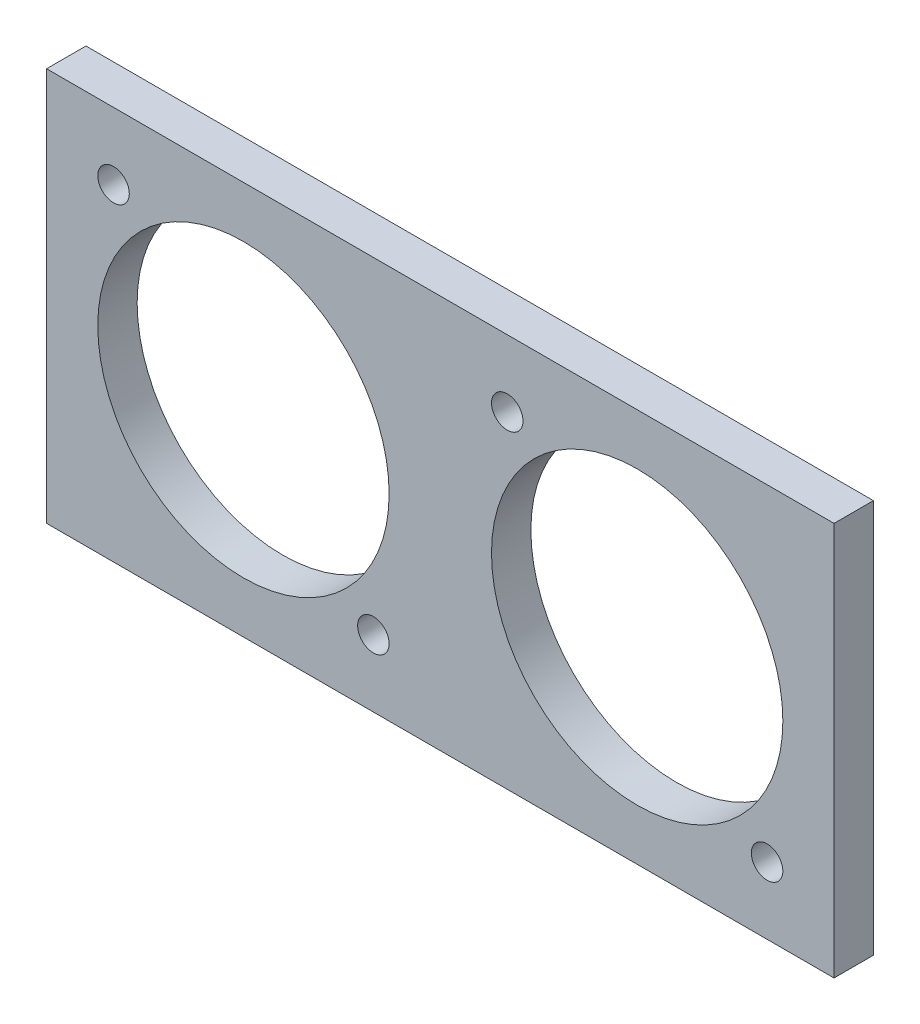
ISO-10303-21;
HEADER;
FILE_DESCRIPTION(('STEP AP214'),'2;1');
FILE_NAME('part.step','',(''),(''),'','','');
FILE_SCHEMA(('AUTOMOTIVE_DESIGN { 1 0 10303 214 1 1 1 1 }'));
ENDSEC;
DATA;
#1=APPLICATION_CONTEXT('core data for automotive mechanical design processes');
#2=APPLICATION_PROTOCOL_DEFINITION('international standard','automotive_design',2000,#1);
#3=PRODUCT_CONTEXT('',#1,'mechanical');
#4=PRODUCT('Part','Part','',(#3));
#5=PRODUCT_RELATED_PRODUCT_CATEGORY('part','',(#4));
#6=PRODUCT_DEFINITION_FORMATION('','',#4);
#7=PRODUCT_DEFINITION_CONTEXT('part definition',#1,'design');
#8=PRODUCT_DEFINITION('design','',#6,#7);
#9=PRODUCT_DEFINITION_SHAPE('','',#8);
#10=(LENGTH_UNIT() NAMED_UNIT(*) SI_UNIT(.MILLI.,.METRE.));
#11=(NAMED_UNIT(*) PLANE_ANGLE_UNIT() SI_UNIT($,.RADIAN.));
#12=(NAMED_UNIT(*) SI_UNIT($,.STERADIAN.) SOLID_ANGLE_UNIT());
#13=UNCERTAINTY_MEASURE_WITH_UNIT(LENGTH_MEASURE(1.E-05),#10,'distance_accuracy_value','');
#14=(GEOMETRIC_REPRESENTATION_CONTEXT(3) GLOBAL_UNCERTAINTY_ASSIGNED_CONTEXT((#13)) GLOBAL_UNIT_ASSIGNED_CONTEXT((#10,
#11,#12)) REPRESENTATION_CONTEXT('',''));
#15=CARTESIAN_POINT('',(0.,0.,0.));
#16=DIRECTION('',(0.,0.,1.));
#17=DIRECTION('',(1.,0.,0.));
#18=AXIS2_PLACEMENT_3D('',#15,#16,#17);
#19=CARTESIAN_POINT('',(0.,0.,3.));
#20=DIRECTION('',(1.,0.,0.));
#21=DIRECTION('',(0.,0.,-1.));
#22=AXIS2_PLACEMENT_3D('',#19,#20,#21);
#23=PLANE('',#22);
#24=DIRECTION('',(0.,-1.,0.));
#25=VECTOR('',#24,1.);
#26=CARTESIAN_POINT('',(0.,0.,0.));
#27=LINE('',#26,#25);
#28=CARTESIAN_POINT('',(0.,30.,0.));
#29=VERTEX_POINT('',#28);
#30=CARTESIAN_POINT('',(0.,0.,0.));
#31=VERTEX_POINT('',#30);
#32=EDGE_CURVE('E106',#29,#31,#27,.T.);
#33=ORIENTED_EDGE('',*,*,#32,.T.);
#34=DIRECTION('',(0.,0.,-1.));
#35=VECTOR('',#34,1.);
#36=CARTESIAN_POINT('',(0.,0.,3.));
#37=LINE('',#36,#35);
#38=CARTESIAN_POINT('',(0.,0.,3.));
#39=VERTEX_POINT('',#38);
#40=EDGE_CURVE('E11',#39,#31,#37,.T.);
#41=ORIENTED_EDGE('',*,*,#40,.F.);
#42=DIRECTION('',(0.,-1.,0.));
#43=VECTOR('',#42,1.);
#44=CARTESIAN_POINT('',(0.,0.,3.));
#45=LINE('',#44,#43);
#46=CARTESIAN_POINT('',(0.,30.,3.));
#47=VERTEX_POINT('',#46);
#48=EDGE_CURVE('E90',#47,#39,#45,.T.);
#49=ORIENTED_EDGE('',*,*,#48,.F.);
#50=DIRECTION('',(0.,0.,-1.));
#51=VECTOR('',#50,1.);
#52=CARTESIAN_POINT('',(0.,30.,3.));
#53=LINE('',#52,#51);
#54=EDGE_CURVE('E102',#47,#29,#53,.T.);
#55=ORIENTED_EDGE('',*,*,#54,.T.);
#56=EDGE_LOOP('',(#33,#41,#49,#55));
#57=FACE_BOUND('',#56,.T.);
#58=ADVANCED_FACE('F38',(#57),#23,.F.);
#59=CARTESIAN_POINT('',(0.,0.,3.));
#60=DIRECTION('',(0.,1.,0.));
#61=DIRECTION('',(0.,0.,1.));
#62=AXIS2_PLACEMENT_3D('',#59,#60,#61);
#63=PLANE('',#62);
#64=DIRECTION('',(1.,0.,0.));
#65=VECTOR('',#64,1.);
#66=CARTESIAN_POINT('',(0.,0.,0.));
#67=LINE('',#66,#65);
#68=CARTESIAN_POINT('',(60.,0.,0.));
#69=VERTEX_POINT('',#68);
#70=EDGE_CURVE('E95',#31,#69,#67,.T.);
#71=ORIENTED_EDGE('',*,*,#70,.T.);
#72=DIRECTION('',(0.,0.,-1.));
#73=VECTOR('',#72,1.);
#74=CARTESIAN_POINT('',(60.,0.,3.));
#75=LINE('',#74,#73);
#76=CARTESIAN_POINT('',(60.,0.,3.));
#77=VERTEX_POINT('',#76);
#78=EDGE_CURVE('E47',#77,#69,#75,.T.);
#79=ORIENTED_EDGE('',*,*,#78,.F.);
#80=DIRECTION('',(1.,0.,0.));
#81=VECTOR('',#80,1.);
#82=CARTESIAN_POINT('',(0.,0.,3.));
#83=LINE('',#82,#81);
#84=EDGE_CURVE('E85',#39,#77,#83,.T.);
#85=ORIENTED_EDGE('',*,*,#84,.F.);
#86=ORIENTED_EDGE('',*,*,#40,.T.);
#87=EDGE_LOOP('',(#71,#79,#85,#86));
#88=FACE_BOUND('',#87,.T.);
#89=ADVANCED_FACE('F94',(#88),#63,.F.);
#90=CARTESIAN_POINT('',(60.,0.,3.));
#91=DIRECTION('',(-1.,0.,0.));
#92=DIRECTION('',(0.,0.,1.));
#93=AXIS2_PLACEMENT_3D('',#90,#91,#92);
#94=PLANE('',#93);
#95=DIRECTION('',(0.,1.,0.));
#96=VECTOR('',#95,1.);
#97=CARTESIAN_POINT('',(60.,0.,0.));
#98=LINE('',#97,#96);
#99=CARTESIAN_POINT('',(60.,30.,0.));
#100=VERTEX_POINT('',#99);
#101=EDGE_CURVE('E72',#69,#100,#98,.T.);
#102=ORIENTED_EDGE('',*,*,#101,.T.);
#103=DIRECTION('',(0.,0.,-1.));
#104=VECTOR('',#103,1.);
#105=CARTESIAN_POINT('',(60.,30.,3.));
#106=LINE('',#105,#104);
#107=CARTESIAN_POINT('',(60.,30.,3.));
#108=VERTEX_POINT('',#107);
#109=EDGE_CURVE('E97',#108,#100,#106,.T.);
#110=ORIENTED_EDGE('',*,*,#109,.F.);
#111=DIRECTION('',(0.,1.,0.));
#112=VECTOR('',#111,1.);
#113=CARTESIAN_POINT('',(60.,0.,3.));
#114=LINE('',#113,#112);
#115=EDGE_CURVE('E88',#77,#108,#114,.T.);
#116=ORIENTED_EDGE('',*,*,#115,.F.);
#117=ORIENTED_EDGE('',*,*,#78,.T.);
#118=EDGE_LOOP('',(#102,#110,#116,#117));
#119=FACE_BOUND('',#118,.T.);
#120=ADVANCED_FACE('F98',(#119),#94,.F.);
#121=CARTESIAN_POINT('',(0.,30.,3.));
#122=DIRECTION('',(0.,-1.,0.));
#123=DIRECTION('',(0.,0.,-1.));
#124=AXIS2_PLACEMENT_3D('',#121,#122,#123);
#125=PLANE('',#124);
#126=DIRECTION('',(-1.,0.,0.));
#127=VECTOR('',#126,1.);
#128=CARTESIAN_POINT('',(0.,30.,0.));
#129=LINE('',#128,#127);
#130=EDGE_CURVE('E78',#100,#29,#129,.T.);
#131=ORIENTED_EDGE('',*,*,#130,.T.);
#132=ORIENTED_EDGE('',*,*,#54,.F.);
#133=DIRECTION('',(-1.,0.,0.));
#134=VECTOR('',#133,1.);
#135=CARTESIAN_POINT('',(0.,30.,3.));
#136=LINE('',#135,#134);
#137=EDGE_CURVE('E55',#108,#47,#136,.T.);
#138=ORIENTED_EDGE('',*,*,#137,.F.);
#139=ORIENTED_EDGE('',*,*,#109,.T.);
#140=EDGE_LOOP('',(#131,#132,#138,#139));
#141=FACE_BOUND('',#140,.T.);
#142=ADVANCED_FACE('F120',(#141),#125,.F.);
#143=CARTESIAN_POINT('',(0.,0.,3.));
#144=DIRECTION('',(0.,0.,-1.));
#145=DIRECTION('',(-1.,0.,0.));
#146=AXIS2_PLACEMENT_3D('',#143,#144,#145);
#147=PLANE('',#146);
#148=CARTESIAN_POINT('',(54.8994949366117,5.10050506338835,3.));
#149=DIRECTION('',(0.,0.,1.));
#150=DIRECTION('',(1.,0.,0.));
#151=AXIS2_PLACEMENT_3D('',#148,#149,#150);
#152=CIRCLE('',#151,1.2);
#153=CARTESIAN_POINT('',(56.0994949366117,5.10050506338835,3.));
#154=VERTEX_POINT('',#153);
#155=EDGE_CURVE('E151',#154,#154,#152,.T.);
#156=ORIENTED_EDGE('',*,*,#155,.F.);
#157=EDGE_LOOP('',(#156));
#158=FACE_BOUND('',#157,.T.);
#159=CARTESIAN_POINT('',(24.8994949366117,5.10050506338836,3.));
#160=DIRECTION('',(0.,0.,1.));
#161=DIRECTION('',(1.,0.,0.));
#162=AXIS2_PLACEMENT_3D('',#159,#160,#161);
#163=CIRCLE('',#162,1.2);
#164=CARTESIAN_POINT('',(26.0994949366117,5.10050506338836,3.));
#165=VERTEX_POINT('',#164);
#166=EDGE_CURVE('E160',#165,#165,#163,.T.);
#167=ORIENTED_EDGE('',*,*,#166,.F.);
#168=EDGE_LOOP('',(#167));
#169=FACE_BOUND('',#168,.T.);
#170=CARTESIAN_POINT('',(5.10050506338832,24.8994949366116,3.));
#171=DIRECTION('',(0.,0.,1.));
#172=DIRECTION('',(1.,0.,0.));
#173=AXIS2_PLACEMENT_3D('',#170,#171,#172);
#174=CIRCLE('',#173,1.2);
#175=CARTESIAN_POINT('',(6.30050506338832,24.8994949366116,3.));
#176=VERTEX_POINT('',#175);
#177=EDGE_CURVE('E135',#176,#176,#174,.T.);
#178=ORIENTED_EDGE('',*,*,#177,.F.);
#179=EDGE_LOOP('',(#178));
#180=FACE_BOUND('',#179,.T.);
#181=CARTESIAN_POINT('',(45.,15.,3.));
#182=DIRECTION('',(0.,0.,1.));
#183=DIRECTION('',(1.,0.,0.));
#184=AXIS2_PLACEMENT_3D('',#181,#182,#183);
#185=CIRCLE('',#184,11.1);
#186=CARTESIAN_POINT('',(56.1,15.,3.));
#187=VERTEX_POINT('',#186);
#188=EDGE_CURVE('E144',#187,#187,#185,.T.);
#189=ORIENTED_EDGE('',*,*,#188,.F.);
#190=EDGE_LOOP('',(#189));
#191=FACE_BOUND('',#190,.T.);
#192=CARTESIAN_POINT('',(35.1005050633883,24.8994949366116,3.));
#193=DIRECTION('',(0.,0.,1.));
#194=DIRECTION('',(1.,0.,0.));
#195=AXIS2_PLACEMENT_3D('',#192,#193,#194);
#196=CIRCLE('',#195,1.2);
#197=CARTESIAN_POINT('',(36.3005050633883,24.8994949366116,3.));
#198=VERTEX_POINT('',#197);
#199=EDGE_CURVE('E167',#198,#198,#196,.T.);
#200=ORIENTED_EDGE('',*,*,#199,.F.);
#201=EDGE_LOOP('',(#200));
#202=FACE_BOUND('',#201,.T.);
#203=CARTESIAN_POINT('',(15.,15.,3.));
#204=DIRECTION('',(0.,0.,1.));
#205=DIRECTION('',(1.,0.,0.));
#206=AXIS2_PLACEMENT_3D('',#203,#204,#205);
#207=CIRCLE('',#206,11.1);
#208=CARTESIAN_POINT('',(26.1,15.,3.));
#209=VERTEX_POINT('',#208);
#210=EDGE_CURVE('E127',#209,#209,#207,.T.);
#211=ORIENTED_EDGE('',*,*,#210,.F.);
#212=EDGE_LOOP('',(#211));
#213=FACE_BOUND('',#212,.T.);
#214=ORIENTED_EDGE('',*,*,#48,.T.);
#215=ORIENTED_EDGE('',*,*,#84,.T.);
#216=ORIENTED_EDGE('',*,*,#115,.T.);
#217=ORIENTED_EDGE('',*,*,#137,.T.);
#218=EDGE_LOOP('',(#214,#215,#216,#217));
#219=FACE_BOUND('',#218,.T.);
#220=ADVANCED_FACE('F86',(#158,#169,#180,#191,#202,#213,#219),#147,.F.);
#221=CARTESIAN_POINT('',(0.,0.,0.));
#222=DIRECTION('',(0.,0.,-1.));
#223=DIRECTION('',(-1.,0.,0.));
#224=AXIS2_PLACEMENT_3D('',#221,#222,#223);
#225=PLANE('',#224);
#226=CARTESIAN_POINT('',(54.8994949366117,5.10050506338835,0.));
#227=DIRECTION('',(0.,0.,1.));
#228=DIRECTION('',(1.,0.,0.));
#229=AXIS2_PLACEMENT_3D('',#226,#227,#228);
#230=CIRCLE('',#229,1.2);
#231=CARTESIAN_POINT('',(56.0994949366117,5.10050506338835,0.));
#232=VERTEX_POINT('',#231);
#233=EDGE_CURVE('E155',#232,#232,#230,.T.);
#234=ORIENTED_EDGE('',*,*,#233,.T.);
#235=EDGE_LOOP('',(#234));
#236=FACE_BOUND('',#235,.T.);
#237=CARTESIAN_POINT('',(24.8994949366117,5.10050506338836,0.));
#238=DIRECTION('',(0.,0.,1.));
#239=DIRECTION('',(1.,0.,0.));
#240=AXIS2_PLACEMENT_3D('',#237,#238,#239);
#241=CIRCLE('',#240,1.2);
#242=CARTESIAN_POINT('',(26.0994949366117,5.10050506338836,0.));
#243=VERTEX_POINT('',#242);
#244=EDGE_CURVE('E140',#243,#243,#241,.T.);
#245=ORIENTED_EDGE('',*,*,#244,.T.);
#246=EDGE_LOOP('',(#245));
#247=FACE_BOUND('',#246,.T.);
#248=CARTESIAN_POINT('',(5.10050506338832,24.8994949366116,0.));
#249=DIRECTION('',(0.,0.,1.));
#250=DIRECTION('',(1.,0.,0.));
#251=AXIS2_PLACEMENT_3D('',#248,#249,#250);
#252=CIRCLE('',#251,1.2);
#253=CARTESIAN_POINT('',(6.30050506338832,24.8994949366116,0.));
#254=VERTEX_POINT('',#253);
#255=EDGE_CURVE('E139',#254,#254,#252,.T.);
#256=ORIENTED_EDGE('',*,*,#255,.T.);
#257=EDGE_LOOP('',(#256));
#258=FACE_BOUND('',#257,.T.);
#259=CARTESIAN_POINT('',(45.,15.,0.));
#260=DIRECTION('',(0.,0.,1.));
#261=DIRECTION('',(1.,0.,0.));
#262=AXIS2_PLACEMENT_3D('',#259,#260,#261);
#263=CIRCLE('',#262,11.1);
#264=CARTESIAN_POINT('',(56.1,15.,0.));
#265=VERTEX_POINT('',#264);
#266=EDGE_CURVE('E131',#265,#265,#263,.T.);
#267=ORIENTED_EDGE('',*,*,#266,.T.);
#268=EDGE_LOOP('',(#267));
#269=FACE_BOUND('',#268,.T.);
#270=CARTESIAN_POINT('',(35.1005050633883,24.8994949366116,0.));
#271=DIRECTION('',(0.,0.,1.));
#272=DIRECTION('',(1.,0.,0.));
#273=AXIS2_PLACEMENT_3D('',#270,#271,#272);
#274=CIRCLE('',#273,1.2);
#275=CARTESIAN_POINT('',(36.3005050633883,24.8994949366116,0.));
#276=VERTEX_POINT('',#275);
#277=EDGE_CURVE('E156',#276,#276,#274,.T.);
#278=ORIENTED_EDGE('',*,*,#277,.T.);
#279=EDGE_LOOP('',(#278));
#280=FACE_BOUND('',#279,.T.);
#281=CARTESIAN_POINT('',(15.,15.,0.));
#282=DIRECTION('',(0.,0.,1.));
#283=DIRECTION('',(1.,0.,0.));
#284=AXIS2_PLACEMENT_3D('',#281,#282,#283);
#285=CIRCLE('',#284,11.1);
#286=CARTESIAN_POINT('',(26.1,15.,0.));
#287=VERTEX_POINT('',#286);
#288=EDGE_CURVE('E110',#287,#287,#285,.T.);
#289=ORIENTED_EDGE('',*,*,#288,.T.);
#290=EDGE_LOOP('',(#289));
#291=FACE_BOUND('',#290,.T.);
#292=ORIENTED_EDGE('',*,*,#32,.F.);
#293=ORIENTED_EDGE('',*,*,#130,.F.);
#294=ORIENTED_EDGE('',*,*,#101,.F.);
#295=ORIENTED_EDGE('',*,*,#70,.F.);
#296=EDGE_LOOP('',(#292,#293,#294,#295));
#297=FACE_BOUND('',#296,.T.);
#298=ADVANCED_FACE('F123',(#236,#247,#258,#269,#280,#291,#297),#225,.T.);
#299=CARTESIAN_POINT('',(15.,15.,0.));
#300=DIRECTION('',(0.,0.,1.));
#301=DIRECTION('',(1.,0.,0.));
#302=AXIS2_PLACEMENT_3D('',#299,#300,#301);
#303=CYLINDRICAL_SURFACE('',#302,11.1);
#304=ORIENTED_EDGE('',*,*,#288,.F.);
#305=EDGE_LOOP('',(#304));
#306=FACE_BOUND('',#305,.T.);
#307=ORIENTED_EDGE('',*,*,#210,.T.);
#308=EDGE_LOOP('',(#307));
#309=FACE_BOUND('',#308,.T.);
#310=ADVANCED_FACE('F181',(#306,#309),#303,.F.);
#311=CARTESIAN_POINT('',(35.1005050633883,24.8994949366116,0.));
#312=DIRECTION('',(0.,0.,1.));
#313=DIRECTION('',(1.,0.,0.));
#314=AXIS2_PLACEMENT_3D('',#311,#312,#313);
#315=CYLINDRICAL_SURFACE('',#314,1.2);
#316=ORIENTED_EDGE('',*,*,#277,.F.);
#317=EDGE_LOOP('',(#316));
#318=FACE_BOUND('',#317,.T.);
#319=ORIENTED_EDGE('',*,*,#199,.T.);
#320=EDGE_LOOP('',(#319));
#321=FACE_BOUND('',#320,.T.);
#322=ADVANCED_FACE('F177',(#318,#321),#315,.F.);
#323=CARTESIAN_POINT('',(45.,15.,0.));
#324=DIRECTION('',(0.,0.,1.));
#325=DIRECTION('',(1.,0.,0.));
#326=AXIS2_PLACEMENT_3D('',#323,#324,#325);
#327=CYLINDRICAL_SURFACE('',#326,11.1);
#328=ORIENTED_EDGE('',*,*,#266,.F.);
#329=EDGE_LOOP('',(#328));
#330=FACE_BOUND('',#329,.T.);
#331=ORIENTED_EDGE('',*,*,#188,.T.);
#332=EDGE_LOOP('',(#331));
#333=FACE_BOUND('',#332,.T.);
#334=ADVANCED_FACE('F180',(#330,#333),#327,.F.);
#335=CARTESIAN_POINT('',(5.10050506338832,24.8994949366116,0.));
#336=DIRECTION('',(0.,0.,1.));
#337=DIRECTION('',(1.,0.,0.));
#338=AXIS2_PLACEMENT_3D('',#335,#336,#337);
#339=CYLINDRICAL_SURFACE('',#338,1.2);
#340=ORIENTED_EDGE('',*,*,#255,.F.);
#341=EDGE_LOOP('',(#340));
#342=FACE_BOUND('',#341,.T.);
#343=ORIENTED_EDGE('',*,*,#177,.T.);
#344=EDGE_LOOP('',(#343));
#345=FACE_BOUND('',#344,.T.);
#346=ADVANCED_FACE('F244',(#342,#345),#339,.F.);
#347=CARTESIAN_POINT('',(24.8994949366117,5.10050506338836,0.));
#348=DIRECTION('',(0.,0.,1.));
#349=DIRECTION('',(1.,0.,0.));
#350=AXIS2_PLACEMENT_3D('',#347,#348,#349);
#351=CYLINDRICAL_SURFACE('',#350,1.2);
#352=ORIENTED_EDGE('',*,*,#244,.F.);
#353=EDGE_LOOP('',(#352));
#354=FACE_BOUND('',#353,.T.);
#355=ORIENTED_EDGE('',*,*,#166,.T.);
#356=EDGE_LOOP('',(#355));
#357=FACE_BOUND('',#356,.T.);
#358=ADVANCED_FACE('F254',(#354,#357),#351,.F.);
#359=CARTESIAN_POINT('',(54.8994949366117,5.10050506338835,0.));
#360=DIRECTION('',(0.,0.,1.));
#361=DIRECTION('',(1.,0.,0.));
#362=AXIS2_PLACEMENT_3D('',#359,#360,#361);
#363=CYLINDRICAL_SURFACE('',#362,1.2);
#364=ORIENTED_EDGE('',*,*,#233,.F.);
#365=EDGE_LOOP('',(#364));
#366=FACE_BOUND('',#365,.T.);
#367=ORIENTED_EDGE('',*,*,#155,.T.);
#368=EDGE_LOOP('',(#367));
#369=FACE_BOUND('',#368,.T.);
#370=ADVANCED_FACE('F263',(#366,#369),#363,.F.);
#371=CLOSED_SHELL('',(#58,#89,#120,#142,#220,#298,#310,#322,#334,#346,#358,#370));
#372=MANIFOLD_SOLID_BREP('B2',#371);
#373=ADVANCED_BREP_SHAPE_REPRESENTATION('',(#18,#372),#14);
#374=SHAPE_DEFINITION_REPRESENTATION(#9,#373);
ENDSEC;
END-ISO-10303-21;
